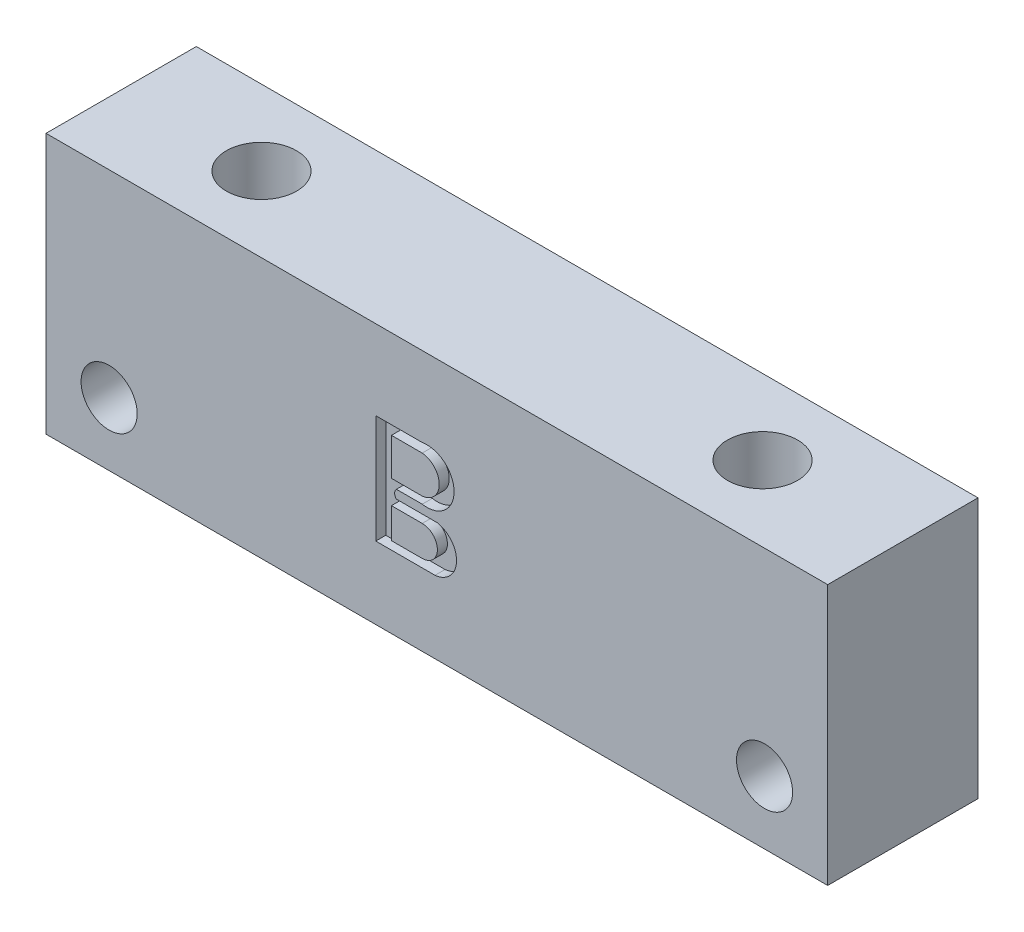
ISO-10303-21;
HEADER;
FILE_DESCRIPTION(('STEP AP214'),'2;1');
FILE_NAME('part.step','',(''),(''),'','','');
FILE_SCHEMA(('AUTOMOTIVE_DESIGN { 1 0 10303 214 1 1 1 1 }'));
ENDSEC;
DATA;
#1=APPLICATION_CONTEXT('core data for automotive mechanical design processes');
#2=APPLICATION_PROTOCOL_DEFINITION('international standard','automotive_design',2000,#1);
#3=PRODUCT_CONTEXT('',#1,'mechanical');
#4=PRODUCT('Part','Part','',(#3));
#5=PRODUCT_RELATED_PRODUCT_CATEGORY('part','',(#4));
#6=PRODUCT_DEFINITION_FORMATION('','',#4);
#7=PRODUCT_DEFINITION_CONTEXT('part definition',#1,'design');
#8=PRODUCT_DEFINITION('design','',#6,#7);
#9=PRODUCT_DEFINITION_SHAPE('','',#8);
#10=(LENGTH_UNIT() NAMED_UNIT(*) SI_UNIT(.MILLI.,.METRE.));
#11=(NAMED_UNIT(*) PLANE_ANGLE_UNIT() SI_UNIT($,.RADIAN.));
#12=(NAMED_UNIT(*) SI_UNIT($,.STERADIAN.) SOLID_ANGLE_UNIT());
#13=UNCERTAINTY_MEASURE_WITH_UNIT(LENGTH_MEASURE(1.E-05),#10,'distance_accuracy_value','');
#14=(GEOMETRIC_REPRESENTATION_CONTEXT(3) GLOBAL_UNCERTAINTY_ASSIGNED_CONTEXT((#13)) GLOBAL_UNIT_ASSIGNED_CONTEXT((#10,
#11,#12)) REPRESENTATION_CONTEXT('',''));
#15=CARTESIAN_POINT('',(0.,0.,0.));
#16=DIRECTION('',(0.,0.,1.));
#17=DIRECTION('',(1.,0.,0.));
#18=AXIS2_PLACEMENT_3D('',#15,#16,#17);
#19=CARTESIAN_POINT('',(-18.2419404705883,-13.3884381338742,-7.5));
#20=DIRECTION('',(0.,-1.,0.));
#21=DIRECTION('',(0.,0.,-1.));
#22=AXIS2_PLACEMENT_3D('',#19,#20,#21);
#23=PLANE('',#22);
#24=CARTESIAN_POINT('',(13.7580595294118,-13.3884381338742,-3.75));
#25=DIRECTION('',(0.,1.,0.));
#26=DIRECTION('',(-1.,0.,0.));
#27=AXIS2_PLACEMENT_3D('',#24,#25,#26);
#28=CIRCLE('',#27,1.75);
#29=CARTESIAN_POINT('',(12.0080595294118,-13.3884381338742,-3.75));
#30=VERTEX_POINT('',#29);
#31=EDGE_CURVE('E307',#30,#30,#28,.T.);
#32=ORIENTED_EDGE('',*,*,#31,.T.);
#33=EDGE_LOOP('',(#32));
#34=FACE_BOUND('',#33,.T.);
#35=CARTESIAN_POINT('',(-11.2419404705882,-13.3884381338742,-3.75));
#36=DIRECTION('',(0.,1.,0.));
#37=DIRECTION('',(-1.,0.,0.));
#38=AXIS2_PLACEMENT_3D('',#35,#36,#37);
#39=CIRCLE('',#38,1.75);
#40=CARTESIAN_POINT('',(-12.9919404705882,-13.3884381338742,-3.75));
#41=VERTEX_POINT('',#40);
#42=EDGE_CURVE('E313',#41,#41,#39,.T.);
#43=ORIENTED_EDGE('',*,*,#42,.T.);
#44=EDGE_LOOP('',(#43));
#45=FACE_BOUND('',#44,.T.);
#46=DIRECTION('',(1.,0.,0.));
#47=VECTOR('',#46,1.);
#48=CARTESIAN_POINT('',(-18.2419404705883,-13.3884381338742,0.));
#49=LINE('',#48,#47);
#50=CARTESIAN_POINT('',(-18.2419404705883,-13.3884381338742,0.));
#51=VERTEX_POINT('',#50);
#52=CARTESIAN_POINT('',(20.7580595294117,-13.3884381338742,0.));
#53=VERTEX_POINT('',#52);
#54=EDGE_CURVE('E328',#51,#53,#49,.T.);
#55=ORIENTED_EDGE('',*,*,#54,.F.);
#56=DIRECTION('',(0.,0.,1.));
#57=VECTOR('',#56,1.);
#58=CARTESIAN_POINT('',(-18.2419404705883,-13.3884381338742,-7.5));
#59=LINE('',#58,#57);
#60=CARTESIAN_POINT('',(-18.2419404705883,-13.3884381338742,-7.5));
#61=VERTEX_POINT('',#60);
#62=EDGE_CURVE('E11',#61,#51,#59,.T.);
#63=ORIENTED_EDGE('',*,*,#62,.F.);
#64=DIRECTION('',(1.,0.,0.));
#65=VECTOR('',#64,1.);
#66=CARTESIAN_POINT('',(-18.2419404705883,-13.3884381338742,-7.5));
#67=LINE('',#66,#65);
#68=CARTESIAN_POINT('',(20.7580595294117,-13.3884381338742,-7.5));
#69=VERTEX_POINT('',#68);
#70=EDGE_CURVE('E331',#61,#69,#67,.T.);
#71=ORIENTED_EDGE('',*,*,#70,.T.);
#72=DIRECTION('',(0.,0.,1.));
#73=VECTOR('',#72,1.);
#74=CARTESIAN_POINT('',(20.7580595294117,-13.3884381338742,-7.5));
#75=LINE('',#74,#73);
#76=EDGE_CURVE('E35',#69,#53,#75,.T.);
#77=ORIENTED_EDGE('',*,*,#76,.T.);
#78=EDGE_LOOP('',(#55,#63,#71,#77));
#79=FACE_BOUND('',#78,.T.);
#80=ADVANCED_FACE('F32',(#34,#45,#79),#23,.T.);
#81=CARTESIAN_POINT('',(-18.2419404705883,-0.388438133874243,-7.5));
#82=DIRECTION('',(-1.,0.,0.));
#83=DIRECTION('',(0.,-1.,0.));
#84=AXIS2_PLACEMENT_3D('',#81,#82,#83);
#85=PLANE('',#84);
#86=DIRECTION('',(0.,-1.,0.));
#87=VECTOR('',#86,1.);
#88=CARTESIAN_POINT('',(-18.2419404705883,-0.388438133874243,0.));
#89=LINE('',#88,#87);
#90=CARTESIAN_POINT('',(-18.2419404705883,-0.388438133874243,0.));
#91=VERTEX_POINT('',#90);
#92=EDGE_CURVE('E335',#91,#51,#89,.T.);
#93=ORIENTED_EDGE('',*,*,#92,.F.);
#94=DIRECTION('',(0.,0.,1.));
#95=VECTOR('',#94,1.);
#96=CARTESIAN_POINT('',(-18.2419404705883,-0.388438133874243,-7.5));
#97=LINE('',#96,#95);
#98=CARTESIAN_POINT('',(-18.2419404705883,-0.388438133874243,-7.5));
#99=VERTEX_POINT('',#98);
#100=EDGE_CURVE('E40',#99,#91,#97,.T.);
#101=ORIENTED_EDGE('',*,*,#100,.F.);
#102=DIRECTION('',(0.,-1.,0.));
#103=VECTOR('',#102,1.);
#104=CARTESIAN_POINT('',(-18.2419404705883,-0.388438133874243,-7.5));
#105=LINE('',#104,#103);
#106=EDGE_CURVE('E341',#99,#61,#105,.T.);
#107=ORIENTED_EDGE('',*,*,#106,.T.);
#108=ORIENTED_EDGE('',*,*,#62,.T.);
#109=EDGE_LOOP('',(#93,#101,#107,#108));
#110=FACE_BOUND('',#109,.T.);
#111=ADVANCED_FACE('F367',(#110),#85,.T.);
#112=CARTESIAN_POINT('',(20.7580595294117,-0.388438133874238,-7.5));
#113=DIRECTION('',(0.,1.,0.));
#114=DIRECTION('',(-1.,0.,0.));
#115=AXIS2_PLACEMENT_3D('',#112,#113,#114);
#116=PLANE('',#115);
#117=CARTESIAN_POINT('',(13.7580595294118,-0.388438133874239,-3.75));
#118=DIRECTION('',(0.,1.,0.));
#119=DIRECTION('',(-1.,0.,0.));
#120=AXIS2_PLACEMENT_3D('',#117,#118,#119);
#121=CIRCLE('',#120,1.75);
#122=CARTESIAN_POINT('',(12.0080595294118,-0.388438133874239,-3.75));
#123=VERTEX_POINT('',#122);
#124=EDGE_CURVE('E293',#123,#123,#121,.T.);
#125=ORIENTED_EDGE('',*,*,#124,.F.);
#126=EDGE_LOOP('',(#125));
#127=FACE_BOUND('',#126,.T.);
#128=CARTESIAN_POINT('',(-11.2419404705883,-0.388438133874242,-3.75));
#129=DIRECTION('',(0.,1.,0.));
#130=DIRECTION('',(-1.,0.,0.));
#131=AXIS2_PLACEMENT_3D('',#128,#129,#130);
#132=CIRCLE('',#131,1.75);
#133=CARTESIAN_POINT('',(-12.9919404705883,-0.388438133874242,-3.75));
#134=VERTEX_POINT('',#133);
#135=EDGE_CURVE('E310',#134,#134,#132,.T.);
#136=ORIENTED_EDGE('',*,*,#135,.F.);
#137=EDGE_LOOP('',(#136));
#138=FACE_BOUND('',#137,.T.);
#139=DIRECTION('',(-1.,0.,0.));
#140=VECTOR('',#139,1.);
#141=CARTESIAN_POINT('',(20.7580595294117,-0.388438133874238,0.));
#142=LINE('',#141,#140);
#143=CARTESIAN_POINT('',(20.7580595294117,-0.388438133874238,0.));
#144=VERTEX_POINT('',#143);
#145=EDGE_CURVE('E349',#144,#91,#142,.T.);
#146=ORIENTED_EDGE('',*,*,#145,.F.);
#147=DIRECTION('',(0.,0.,1.));
#148=VECTOR('',#147,1.);
#149=CARTESIAN_POINT('',(20.7580595294117,-0.388438133874238,-7.5));
#150=LINE('',#149,#148);
#151=CARTESIAN_POINT('',(20.7580595294117,-0.388438133874238,-7.5));
#152=VERTEX_POINT('',#151);
#153=EDGE_CURVE('E354',#152,#144,#150,.T.);
#154=ORIENTED_EDGE('',*,*,#153,.F.);
#155=DIRECTION('',(-1.,0.,0.));
#156=VECTOR('',#155,1.);
#157=CARTESIAN_POINT('',(20.7580595294117,-0.388438133874238,-7.5));
#158=LINE('',#157,#156);
#159=EDGE_CURVE('E338',#152,#99,#158,.T.);
#160=ORIENTED_EDGE('',*,*,#159,.T.);
#161=ORIENTED_EDGE('',*,*,#100,.T.);
#162=EDGE_LOOP('',(#146,#154,#160,#161));
#163=FACE_BOUND('',#162,.T.);
#164=ADVANCED_FACE('F373',(#127,#138,#163),#116,.T.);
#165=CARTESIAN_POINT('',(20.7580595294117,-13.3884381338742,-7.5));
#166=DIRECTION('',(1.,0.,0.));
#167=DIRECTION('',(0.,0.,-1.));
#168=AXIS2_PLACEMENT_3D('',#165,#166,#167);
#169=PLANE('',#168);
#170=DIRECTION('',(0.,1.,0.));
#171=VECTOR('',#170,1.);
#172=CARTESIAN_POINT('',(20.7580595294117,-13.3884381338742,0.));
#173=LINE('',#172,#171);
#174=EDGE_CURVE('E346',#53,#144,#173,.T.);
#175=ORIENTED_EDGE('',*,*,#174,.F.);
#176=ORIENTED_EDGE('',*,*,#76,.F.);
#177=DIRECTION('',(0.,1.,0.));
#178=VECTOR('',#177,1.);
#179=CARTESIAN_POINT('',(20.7580595294117,-13.3884381338742,-7.5));
#180=LINE('',#179,#178);
#181=EDGE_CURVE('E334',#69,#152,#180,.T.);
#182=ORIENTED_EDGE('',*,*,#181,.T.);
#183=ORIENTED_EDGE('',*,*,#153,.T.);
#184=EDGE_LOOP('',(#175,#176,#182,#183));
#185=FACE_BOUND('',#184,.T.);
#186=ADVANCED_FACE('F362',(#185),#169,.T.);
#187=CARTESIAN_POINT('',(0.,0.,-7.5));
#188=DIRECTION('',(0.,0.,1.));
#189=DIRECTION('',(1.,0.,0.));
#190=AXIS2_PLACEMENT_3D('',#187,#188,#189);
#191=PLANE('',#190);
#192=CARTESIAN_POINT('',(17.6080595294117,-10.2384381338742,-7.5));
#193=DIRECTION('',(0.,0.,1.));
#194=DIRECTION('',(1.,0.,0.));
#195=AXIS2_PLACEMENT_3D('',#192,#193,#194);
#196=CIRCLE('',#195,1.4);
#197=CARTESIAN_POINT('',(19.0080595294117,-10.2384381338742,-7.5));
#198=VERTEX_POINT('',#197);
#199=EDGE_CURVE('E319',#198,#198,#196,.T.);
#200=ORIENTED_EDGE('',*,*,#199,.T.);
#201=EDGE_LOOP('',(#200));
#202=FACE_BOUND('',#201,.T.);
#203=CARTESIAN_POINT('',(-15.0919404705883,-10.2384381338742,-7.5));
#204=DIRECTION('',(0.,0.,1.));
#205=DIRECTION('',(1.,0.,0.));
#206=AXIS2_PLACEMENT_3D('',#203,#204,#205);
#207=CIRCLE('',#206,1.4);
#208=CARTESIAN_POINT('',(-13.6919404705883,-10.2384381338742,-7.5));
#209=VERTEX_POINT('',#208);
#210=EDGE_CURVE('E325',#209,#209,#207,.T.);
#211=ORIENTED_EDGE('',*,*,#210,.T.);
#212=EDGE_LOOP('',(#211));
#213=FACE_BOUND('',#212,.T.);
#214=ORIENTED_EDGE('',*,*,#70,.F.);
#215=ORIENTED_EDGE('',*,*,#106,.F.);
#216=ORIENTED_EDGE('',*,*,#159,.F.);
#217=ORIENTED_EDGE('',*,*,#181,.F.);
#218=EDGE_LOOP('',(#214,#215,#216,#217));
#219=FACE_BOUND('',#218,.T.);
#220=ADVANCED_FACE('F370',(#202,#213,#219),#191,.F.);
#221=CARTESIAN_POINT('',(0.,0.,0.));
#222=DIRECTION('',(0.,0.,1.));
#223=DIRECTION('',(1.,0.,0.));
#224=AXIS2_PLACEMENT_3D('',#221,#222,#223);
#225=PLANE('',#224);
#226=DIRECTION('',(0.,-1.,0.));
#227=VECTOR('',#226,1.);
#228=CARTESIAN_POINT('',(-1.78948456051842,-4.36198499661344,0.));
#229=LINE('',#228,#227);
#230=CARTESIAN_POINT('',(-1.78948456051842,-4.36198499661344,0.));
#231=VERTEX_POINT('',#230);
#232=CARTESIAN_POINT('',(-1.78948456051842,-9.78079470513649,0.));
#233=VERTEX_POINT('',#232);
#234=EDGE_CURVE('E48',#231,#233,#229,.T.);
#235=ORIENTED_EDGE('',*,*,#234,.F.);
#236=DIRECTION('',(-1.,0.,0.));
#237=VECTOR('',#236,1.);
#238=CARTESIAN_POINT('',(-1.78948456051842,-4.36198499661344,0.));
#239=LINE('',#238,#237);
#240=CARTESIAN_POINT('',(0.528429433948041,-4.36198499661344,0.));
#241=VERTEX_POINT('',#240);
#242=EDGE_CURVE('E248',#241,#231,#239,.T.);
#243=ORIENTED_EDGE('',*,*,#242,.F.);
#244=CARTESIAN_POINT('',(0.764662766271646,-5.69476469604169,0.));
#245=DIRECTION('',(0.,0.,1.));
#246=DIRECTION('',(-1.,0.,0.));
#247=AXIS2_PLACEMENT_3D('',#244,#245,#246);
#248=CIRCLE('',#247,1.35355380924024);
#249=CARTESIAN_POINT('',(0.528429433948041,-7.02754439546993,0.));
#250=VERTEX_POINT('',#249);
#251=EDGE_CURVE('E286',#250,#241,#248,.T.);
#252=ORIENTED_EDGE('',*,*,#251,.F.);
#253=DIRECTION('',(1.,0.,0.));
#254=VECTOR('',#253,1.);
#255=CARTESIAN_POINT('',(0.528429433948041,-7.02754439546993,0.));
#256=LINE('',#255,#254);
#257=CARTESIAN_POINT('',(-0.758815546584968,-7.02754439546993,0.));
#258=VERTEX_POINT('',#257);
#259=EDGE_CURVE('E283',#258,#250,#256,.T.);
#260=ORIENTED_EDGE('',*,*,#259,.F.);
#261=CARTESIAN_POINT('',(-0.545804965205176,-7.24055497684972,0.));
#262=DIRECTION('',(0.,0.,-1.));
#263=DIRECTION('',(1.,0.,0.));
#264=AXIS2_PLACEMENT_3D('',#261,#262,#263);
#265=CIRCLE('',#264,0.301242453116279);
#266=CARTESIAN_POINT('',(-0.758815546584968,-7.45356555822951,0.));
#267=VERTEX_POINT('',#266);
#268=EDGE_CURVE('E280',#267,#258,#265,.T.);
#269=ORIENTED_EDGE('',*,*,#268,.F.);
#270=DIRECTION('',(-1.,0.,0.));
#271=VECTOR('',#270,1.);
#272=CARTESIAN_POINT('',(-0.758815546584968,-7.45356555822951,0.));
#273=LINE('',#272,#271);
#274=CARTESIAN_POINT('',(1.28563615484278,-7.45356555822951,0.));
#275=VERTEX_POINT('',#274);
#276=EDGE_CURVE('E277',#275,#267,#273,.T.);
#277=ORIENTED_EDGE('',*,*,#276,.F.);
#278=CARTESIAN_POINT('',(1.06369113217994,-8.60896906760546,0.));
#279=DIRECTION('',(0.,0.,1.));
#280=DIRECTION('',(-1.,0.,0.));
#281=AXIS2_PLACEMENT_3D('',#278,#279,#280);
#282=CIRCLE('',#281,1.17652745933236);
#283=CARTESIAN_POINT('',(1.16876985404146,-9.78079470513649,0.));
#284=VERTEX_POINT('',#283);
#285=EDGE_CURVE('E274',#284,#275,#282,.T.);
#286=ORIENTED_EDGE('',*,*,#285,.F.);
#287=DIRECTION('',(1.,0.,0.));
#288=VECTOR('',#287,1.);
#289=CARTESIAN_POINT('',(1.16876985404146,-9.78079470513649,0.));
#290=LINE('',#289,#288);
#291=EDGE_CURVE('E271',#233,#284,#290,.T.);
#292=ORIENTED_EDGE('',*,*,#291,.F.);
#293=EDGE_LOOP('',(#235,#243,#252,#260,#269,#277,#286,#292));
#294=FACE_BOUND('',#293,.T.);
#295=CARTESIAN_POINT('',(17.6080595294117,-10.2384381338742,0.));
#296=DIRECTION('',(0.,0.,1.));
#297=DIRECTION('',(1.,0.,0.));
#298=AXIS2_PLACEMENT_3D('',#295,#296,#297);
#299=CIRCLE('',#298,1.4);
#300=CARTESIAN_POINT('',(19.0080595294117,-10.2384381338742,0.));
#301=VERTEX_POINT('',#300);
#302=EDGE_CURVE('E316',#301,#301,#299,.T.);
#303=ORIENTED_EDGE('',*,*,#302,.F.);
#304=EDGE_LOOP('',(#303));
#305=FACE_BOUND('',#304,.T.);
#306=CARTESIAN_POINT('',(-15.0919404705883,-10.2384381338742,0.));
#307=DIRECTION('',(0.,0.,1.));
#308=DIRECTION('',(1.,0.,0.));
#309=AXIS2_PLACEMENT_3D('',#306,#307,#308);
#310=CIRCLE('',#309,1.4);
#311=CARTESIAN_POINT('',(-13.6919404705883,-10.2384381338742,0.));
#312=VERTEX_POINT('',#311);
#313=EDGE_CURVE('E322',#312,#312,#310,.T.);
#314=ORIENTED_EDGE('',*,*,#313,.F.);
#315=EDGE_LOOP('',(#314));
#316=FACE_BOUND('',#315,.T.);
#317=ORIENTED_EDGE('',*,*,#54,.T.);
#318=ORIENTED_EDGE('',*,*,#174,.T.);
#319=ORIENTED_EDGE('',*,*,#145,.T.);
#320=ORIENTED_EDGE('',*,*,#92,.T.);
#321=EDGE_LOOP('',(#317,#318,#319,#320));
#322=FACE_BOUND('',#321,.T.);
#323=ADVANCED_FACE('F364',(#294,#305,#316,#322),#225,.T.);
#324=CARTESIAN_POINT('',(-15.0919404705883,-10.2384381338742,-7.5));
#325=DIRECTION('',(0.,0.,1.));
#326=DIRECTION('',(1.,0.,0.));
#327=AXIS2_PLACEMENT_3D('',#324,#325,#326);
#328=CYLINDRICAL_SURFACE('',#327,1.4);
#329=ORIENTED_EDGE('',*,*,#210,.F.);
#330=EDGE_LOOP('',(#329));
#331=FACE_BOUND('',#330,.T.);
#332=ORIENTED_EDGE('',*,*,#313,.T.);
#333=EDGE_LOOP('',(#332));
#334=FACE_BOUND('',#333,.T.);
#335=ADVANCED_FACE('F406',(#331,#334),#328,.F.);
#336=CARTESIAN_POINT('',(17.6080595294117,-10.2384381338742,-7.5));
#337=DIRECTION('',(0.,0.,1.));
#338=DIRECTION('',(1.,0.,0.));
#339=AXIS2_PLACEMENT_3D('',#336,#337,#338);
#340=CYLINDRICAL_SURFACE('',#339,1.4);
#341=ORIENTED_EDGE('',*,*,#199,.F.);
#342=EDGE_LOOP('',(#341));
#343=FACE_BOUND('',#342,.T.);
#344=ORIENTED_EDGE('',*,*,#302,.T.);
#345=EDGE_LOOP('',(#344));
#346=FACE_BOUND('',#345,.T.);
#347=ADVANCED_FACE('F396',(#343,#346),#340,.F.);
#348=CARTESIAN_POINT('',(-11.2419404705882,-13.3884381338742,-3.75));
#349=DIRECTION('',(0.,1.,0.));
#350=DIRECTION('',(-1.,0.,0.));
#351=AXIS2_PLACEMENT_3D('',#348,#349,#350);
#352=CYLINDRICAL_SURFACE('',#351,1.75);
#353=ORIENTED_EDGE('',*,*,#42,.F.);
#354=EDGE_LOOP('',(#353));
#355=FACE_BOUND('',#354,.T.);
#356=ORIENTED_EDGE('',*,*,#135,.T.);
#357=EDGE_LOOP('',(#356));
#358=FACE_BOUND('',#357,.T.);
#359=ADVANCED_FACE('F392',(#355,#358),#352,.F.);
#360=CARTESIAN_POINT('',(13.7580595294118,-13.3884381338742,-3.75));
#361=DIRECTION('',(0.,1.,0.));
#362=DIRECTION('',(-1.,0.,0.));
#363=AXIS2_PLACEMENT_3D('',#360,#361,#362);
#364=CYLINDRICAL_SURFACE('',#363,1.75);
#365=ORIENTED_EDGE('',*,*,#31,.F.);
#366=EDGE_LOOP('',(#365));
#367=FACE_BOUND('',#366,.T.);
#368=ORIENTED_EDGE('',*,*,#124,.T.);
#369=EDGE_LOOP('',(#368));
#370=FACE_BOUND('',#369,.T.);
#371=ADVANCED_FACE('F395',(#367,#370),#364,.F.);
#372=CARTESIAN_POINT('',(-1.78948456051842,-4.36198499661344,-0.5));
#373=DIRECTION('',(-1.,0.,0.));
#374=DIRECTION('',(0.,-1.,0.));
#375=AXIS2_PLACEMENT_3D('',#372,#373,#374);
#376=PLANE('',#375);
#377=ORIENTED_EDGE('',*,*,#234,.T.);
#378=DIRECTION('',(0.,0.,1.));
#379=VECTOR('',#378,1.);
#380=CARTESIAN_POINT('',(-1.78948456051842,-9.78079470513649,-0.5));
#381=LINE('',#380,#379);
#382=CARTESIAN_POINT('',(-1.78948456051842,-9.78079470513649,-0.5));
#383=VERTEX_POINT('',#382);
#384=EDGE_CURVE('E269',#383,#233,#381,.T.);
#385=ORIENTED_EDGE('',*,*,#384,.F.);
#386=DIRECTION('',(0.,-1.,0.));
#387=VECTOR('',#386,1.);
#388=CARTESIAN_POINT('',(-1.78948456051842,-4.36198499661344,-0.5));
#389=LINE('',#388,#387);
#390=CARTESIAN_POINT('',(-1.78948456051842,-4.36198499661344,-0.5));
#391=VERTEX_POINT('',#390);
#392=EDGE_CURVE('E244',#391,#383,#389,.T.);
#393=ORIENTED_EDGE('',*,*,#392,.F.);
#394=DIRECTION('',(0.,0.,1.));
#395=VECTOR('',#394,1.);
#396=CARTESIAN_POINT('',(-1.78948456051842,-4.36198499661344,-0.5));
#397=LINE('',#396,#395);
#398=EDGE_CURVE('E291',#391,#231,#397,.T.);
#399=ORIENTED_EDGE('',*,*,#398,.T.);
#400=EDGE_LOOP('',(#377,#385,#393,#399));
#401=FACE_BOUND('',#400,.T.);
#402=ADVANCED_FACE('F403',(#401),#376,.F.);
#403=CARTESIAN_POINT('',(-1.78948456051842,-4.36198499661344,-0.5));
#404=DIRECTION('',(0.,1.,0.));
#405=DIRECTION('',(0.,0.,1.));
#406=AXIS2_PLACEMENT_3D('',#403,#404,#405);
#407=PLANE('',#406);
#408=ORIENTED_EDGE('',*,*,#242,.T.);
#409=ORIENTED_EDGE('',*,*,#398,.F.);
#410=DIRECTION('',(-1.,0.,0.));
#411=VECTOR('',#410,1.);
#412=CARTESIAN_POINT('',(-1.78948456051842,-4.36198499661344,-0.5));
#413=LINE('',#412,#411);
#414=CARTESIAN_POINT('',(0.528429433948041,-4.36198499661344,-0.5));
#415=VERTEX_POINT('',#414);
#416=EDGE_CURVE('E266',#415,#391,#413,.T.);
#417=ORIENTED_EDGE('',*,*,#416,.F.);
#418=DIRECTION('',(0.,0.,1.));
#419=VECTOR('',#418,1.);
#420=CARTESIAN_POINT('',(0.528429433948041,-4.36198499661344,-0.5));
#421=LINE('',#420,#419);
#422=EDGE_CURVE('E294',#415,#241,#421,.T.);
#423=ORIENTED_EDGE('',*,*,#422,.T.);
#424=EDGE_LOOP('',(#408,#409,#417,#423));
#425=FACE_BOUND('',#424,.T.);
#426=ADVANCED_FACE('F464',(#425),#407,.F.);
#427=CARTESIAN_POINT('',(0.764662766271646,-5.69476469604169,-0.5));
#428=DIRECTION('',(0.,0.,1.));
#429=DIRECTION('',(1.,0.,0.));
#430=AXIS2_PLACEMENT_3D('',#427,#428,#429);
#431=CYLINDRICAL_SURFACE('',#430,1.35355380924024);
#432=ORIENTED_EDGE('',*,*,#251,.T.);
#433=ORIENTED_EDGE('',*,*,#422,.F.);
#434=CARTESIAN_POINT('',(0.764662766271646,-5.69476469604169,-0.5));
#435=DIRECTION('',(0.,0.,1.));
#436=DIRECTION('',(-1.,0.,0.));
#437=AXIS2_PLACEMENT_3D('',#434,#435,#436);
#438=CIRCLE('',#437,1.35355380924024);
#439=CARTESIAN_POINT('',(0.528429433948041,-7.02754439546993,-0.5));
#440=VERTEX_POINT('',#439);
#441=EDGE_CURVE('E263',#440,#415,#438,.T.);
#442=ORIENTED_EDGE('',*,*,#441,.F.);
#443=DIRECTION('',(0.,0.,1.));
#444=VECTOR('',#443,1.);
#445=CARTESIAN_POINT('',(0.528429433948041,-7.02754439546993,-0.5));
#446=LINE('',#445,#444);
#447=EDGE_CURVE('E296',#440,#250,#446,.T.);
#448=ORIENTED_EDGE('',*,*,#447,.T.);
#449=EDGE_LOOP('',(#432,#433,#442,#448));
#450=FACE_BOUND('',#449,.T.);
#451=ADVANCED_FACE('F467',(#450),#431,.F.);
#452=CARTESIAN_POINT('',(0.528429433948041,-7.02754439546993,-0.5));
#453=DIRECTION('',(0.,-1.,0.));
#454=DIRECTION('',(0.,0.,-1.));
#455=AXIS2_PLACEMENT_3D('',#452,#453,#454);
#456=PLANE('',#455);
#457=ORIENTED_EDGE('',*,*,#259,.T.);
#458=ORIENTED_EDGE('',*,*,#447,.F.);
#459=DIRECTION('',(1.,0.,0.));
#460=VECTOR('',#459,1.);
#461=CARTESIAN_POINT('',(0.528429433948041,-7.02754439546993,-0.5));
#462=LINE('',#461,#460);
#463=CARTESIAN_POINT('',(-0.758815546584968,-7.02754439546993,-0.5));
#464=VERTEX_POINT('',#463);
#465=EDGE_CURVE('E260',#464,#440,#462,.T.);
#466=ORIENTED_EDGE('',*,*,#465,.F.);
#467=DIRECTION('',(0.,0.,1.));
#468=VECTOR('',#467,1.);
#469=CARTESIAN_POINT('',(-0.758815546584968,-7.02754439546993,-0.5));
#470=LINE('',#469,#468);
#471=EDGE_CURVE('E298',#464,#258,#470,.T.);
#472=ORIENTED_EDGE('',*,*,#471,.T.);
#473=EDGE_LOOP('',(#457,#458,#466,#472));
#474=FACE_BOUND('',#473,.T.);
#475=ADVANCED_FACE('F471',(#474),#456,.F.);
#476=CARTESIAN_POINT('',(-0.545804965205176,-7.24055497684972,-0.5));
#477=DIRECTION('',(0.,0.,1.));
#478=DIRECTION('',(1.,0.,0.));
#479=AXIS2_PLACEMENT_3D('',#476,#477,#478);
#480=CYLINDRICAL_SURFACE('',#479,0.301242453116279);
#481=ORIENTED_EDGE('',*,*,#268,.T.);
#482=ORIENTED_EDGE('',*,*,#471,.F.);
#483=CARTESIAN_POINT('',(-0.545804965205176,-7.24055497684972,-0.5));
#484=DIRECTION('',(0.,0.,-1.));
#485=DIRECTION('',(1.,0.,0.));
#486=AXIS2_PLACEMENT_3D('',#483,#484,#485);
#487=CIRCLE('',#486,0.301242453116279);
#488=CARTESIAN_POINT('',(-0.758815546584968,-7.45356555822951,-0.5));
#489=VERTEX_POINT('',#488);
#490=EDGE_CURVE('E257',#489,#464,#487,.T.);
#491=ORIENTED_EDGE('',*,*,#490,.F.);
#492=DIRECTION('',(0.,0.,1.));
#493=VECTOR('',#492,1.);
#494=CARTESIAN_POINT('',(-0.758815546584968,-7.45356555822951,-0.5));
#495=LINE('',#494,#493);
#496=EDGE_CURVE('E300',#489,#267,#495,.T.);
#497=ORIENTED_EDGE('',*,*,#496,.T.);
#498=EDGE_LOOP('',(#481,#482,#491,#497));
#499=FACE_BOUND('',#498,.T.);
#500=ADVANCED_FACE('F475',(#499),#480,.T.);
#501=CARTESIAN_POINT('',(-0.758815546584968,-7.45356555822951,-0.5));
#502=DIRECTION('',(0.,1.,0.));
#503=DIRECTION('',(0.,0.,1.));
#504=AXIS2_PLACEMENT_3D('',#501,#502,#503);
#505=PLANE('',#504);
#506=ORIENTED_EDGE('',*,*,#276,.T.);
#507=ORIENTED_EDGE('',*,*,#496,.F.);
#508=DIRECTION('',(-1.,0.,0.));
#509=VECTOR('',#508,1.);
#510=CARTESIAN_POINT('',(-0.758815546584968,-7.45356555822951,-0.5));
#511=LINE('',#510,#509);
#512=CARTESIAN_POINT('',(1.28563615484278,-7.45356555822951,-0.5));
#513=VERTEX_POINT('',#512);
#514=EDGE_CURVE('E254',#513,#489,#511,.T.);
#515=ORIENTED_EDGE('',*,*,#514,.F.);
#516=DIRECTION('',(0.,0.,1.));
#517=VECTOR('',#516,1.);
#518=CARTESIAN_POINT('',(1.28563615484278,-7.45356555822951,-0.5));
#519=LINE('',#518,#517);
#520=EDGE_CURVE('E302',#513,#275,#519,.T.);
#521=ORIENTED_EDGE('',*,*,#520,.T.);
#522=EDGE_LOOP('',(#506,#507,#515,#521));
#523=FACE_BOUND('',#522,.T.);
#524=ADVANCED_FACE('F479',(#523),#505,.F.);
#525=CARTESIAN_POINT('',(1.06369113217994,-8.60896906760546,-0.5));
#526=DIRECTION('',(0.,0.,1.));
#527=DIRECTION('',(1.,0.,0.));
#528=AXIS2_PLACEMENT_3D('',#525,#526,#527);
#529=CYLINDRICAL_SURFACE('',#528,1.17652745933236);
#530=ORIENTED_EDGE('',*,*,#285,.T.);
#531=ORIENTED_EDGE('',*,*,#520,.F.);
#532=CARTESIAN_POINT('',(1.06369113217994,-8.60896906760546,-0.5));
#533=DIRECTION('',(0.,0.,1.));
#534=DIRECTION('',(-1.,0.,0.));
#535=AXIS2_PLACEMENT_3D('',#532,#533,#534);
#536=CIRCLE('',#535,1.17652745933236);
#537=CARTESIAN_POINT('',(1.16876985404146,-9.78079470513649,-0.5));
#538=VERTEX_POINT('',#537);
#539=EDGE_CURVE('E251',#538,#513,#536,.T.);
#540=ORIENTED_EDGE('',*,*,#539,.F.);
#541=DIRECTION('',(0.,0.,1.));
#542=VECTOR('',#541,1.);
#543=CARTESIAN_POINT('',(1.16876985404146,-9.78079470513649,-0.5));
#544=LINE('',#543,#542);
#545=EDGE_CURVE('E304',#538,#284,#544,.T.);
#546=ORIENTED_EDGE('',*,*,#545,.T.);
#547=EDGE_LOOP('',(#530,#531,#540,#546));
#548=FACE_BOUND('',#547,.T.);
#549=ADVANCED_FACE('F483',(#548),#529,.F.);
#550=CARTESIAN_POINT('',(1.16876985404146,-9.78079470513649,-0.5));
#551=DIRECTION('',(0.,-1.,0.));
#552=DIRECTION('',(0.,0.,-1.));
#553=AXIS2_PLACEMENT_3D('',#550,#551,#552);
#554=PLANE('',#553);
#555=ORIENTED_EDGE('',*,*,#291,.T.);
#556=ORIENTED_EDGE('',*,*,#545,.F.);
#557=DIRECTION('',(1.,0.,0.));
#558=VECTOR('',#557,1.);
#559=CARTESIAN_POINT('',(1.16876985404146,-9.78079470513649,-0.5));
#560=LINE('',#559,#558);
#561=EDGE_CURVE('E247',#383,#538,#560,.T.);
#562=ORIENTED_EDGE('',*,*,#561,.F.);
#563=ORIENTED_EDGE('',*,*,#384,.T.);
#564=EDGE_LOOP('',(#555,#556,#562,#563));
#565=FACE_BOUND('',#564,.T.);
#566=ADVANCED_FACE('F463',(#565),#554,.F.);
#567=CARTESIAN_POINT('',(1.06369113217994,-8.60896906760546,-0.5));
#568=DIRECTION('',(0.,0.,-1.));
#569=DIRECTION('',(-1.,0.,0.));
#570=AXIS2_PLACEMENT_3D('',#567,#568,#569);
#571=PLANE('',#570);
#572=DIRECTION('',(-1.,0.,0.));
#573=VECTOR('',#572,1.);
#574=CARTESIAN_POINT('',(0.528429433948041,-4.81930558451182,-0.5));
#575=LINE('',#574,#573);
#576=CARTESIAN_POINT('',(0.528429433948041,-4.81930558451182,-0.5));
#577=VERTEX_POINT('',#576);
#578=CARTESIAN_POINT('',(-1.00649638053674,-4.81930558451182,-0.5));
#579=VERTEX_POINT('',#578);
#580=EDGE_CURVE('E189',#577,#579,#575,.T.);
#581=ORIENTED_EDGE('',*,*,#580,.F.);
#582=CARTESIAN_POINT('',(0.443970010058192,-5.74877001626106,-0.5));
#583=DIRECTION('',(0.,0.,1.));
#584=DIRECTION('',(-1.,0.,0.));
#585=AXIS2_PLACEMENT_3D('',#582,#583,#584);
#586=CIRCLE('',#585,0.933293910925567);
#587=CARTESIAN_POINT('',(0.528429433948041,-6.6782344480103,-0.5));
#588=VERTEX_POINT('',#587);
#589=EDGE_CURVE('E182',#588,#577,#586,.T.);
#590=ORIENTED_EDGE('',*,*,#589,.F.);
#591=DIRECTION('',(1.,0.,0.));
#592=VECTOR('',#591,1.);
#593=CARTESIAN_POINT('',(-1.00649638053674,-6.6782344480103,-0.5));
#594=LINE('',#593,#592);
#595=CARTESIAN_POINT('',(-1.00649638053674,-6.6782344480103,-0.5));
#596=VERTEX_POINT('',#595);
#597=EDGE_CURVE('E192',#596,#588,#594,.T.);
#598=ORIENTED_EDGE('',*,*,#597,.F.);
#599=DIRECTION('',(0.,-1.,0.));
#600=VECTOR('',#599,1.);
#601=CARTESIAN_POINT('',(-1.00649638053674,-4.81930558451182,-0.5));
#602=LINE('',#601,#600);
#603=EDGE_CURVE('E174',#579,#596,#602,.T.);
#604=ORIENTED_EDGE('',*,*,#603,.F.);
#605=EDGE_LOOP('',(#581,#590,#598,#604));
#606=FACE_BOUND('',#605,.T.);
#607=CARTESIAN_POINT('',(0.528429433948041,-8.61580259993033,-0.5));
#608=DIRECTION('',(0.,0.,1.));
#609=DIRECTION('',(-1.,0.,0.));
#610=AXIS2_PLACEMENT_3D('',#607,#608,#609);
#611=CIRCLE('',#610,0.757206720894743);
#612=CARTESIAN_POINT('',(0.528429433948041,-9.37300932082508,-0.5));
#613=VERTEX_POINT('',#612);
#614=CARTESIAN_POINT('',(0.528429433948041,-7.85859587903559,-0.5));
#615=VERTEX_POINT('',#614);
#616=EDGE_CURVE('E215',#613,#615,#611,.T.);
#617=ORIENTED_EDGE('',*,*,#616,.F.);
#618=DIRECTION('',(1.,0.,0.));
#619=VECTOR('',#618,1.);
#620=CARTESIAN_POINT('',(-1.00649638053674,-9.37300932082508,-0.5));
#621=LINE('',#620,#619);
#622=CARTESIAN_POINT('',(-1.00649638053674,-9.37300932082508,-0.5));
#623=VERTEX_POINT('',#622);
#624=EDGE_CURVE('E225',#623,#613,#621,.T.);
#625=ORIENTED_EDGE('',*,*,#624,.F.);
#626=DIRECTION('',(0.,-1.,0.));
#627=VECTOR('',#626,1.);
#628=CARTESIAN_POINT('',(-1.00649638053674,-7.85859587903559,-0.5));
#629=LINE('',#628,#627);
#630=CARTESIAN_POINT('',(-1.00649638053674,-7.85859587903559,-0.5));
#631=VERTEX_POINT('',#630);
#632=EDGE_CURVE('E222',#631,#623,#629,.T.);
#633=ORIENTED_EDGE('',*,*,#632,.F.);
#634=DIRECTION('',(-1.,0.,0.));
#635=VECTOR('',#634,1.);
#636=CARTESIAN_POINT('',(0.528429433948041,-7.85859587903559,-0.5));
#637=LINE('',#636,#635);
#638=EDGE_CURVE('E218',#615,#631,#637,.T.);
#639=ORIENTED_EDGE('',*,*,#638,.F.);
#640=EDGE_LOOP('',(#617,#625,#633,#639));
#641=FACE_BOUND('',#640,.T.);
#642=ORIENTED_EDGE('',*,*,#392,.T.);
#643=ORIENTED_EDGE('',*,*,#561,.T.);
#644=ORIENTED_EDGE('',*,*,#539,.T.);
#645=ORIENTED_EDGE('',*,*,#514,.T.);
#646=ORIENTED_EDGE('',*,*,#490,.T.);
#647=ORIENTED_EDGE('',*,*,#465,.T.);
#648=ORIENTED_EDGE('',*,*,#441,.T.);
#649=ORIENTED_EDGE('',*,*,#416,.T.);
#650=EDGE_LOOP('',(#642,#643,#644,#645,#646,#647,#648,#649));
#651=FACE_BOUND('',#650,.T.);
#652=ADVANCED_FACE('F186',(#606,#641,#651),#571,.F.);
#653=CARTESIAN_POINT('',(0.528429433948041,-8.61580259993033,-0.5));
#654=DIRECTION('',(0.,0.,1.));
#655=DIRECTION('',(1.,0.,0.));
#656=AXIS2_PLACEMENT_3D('',#653,#654,#655);
#657=CYLINDRICAL_SURFACE('',#656,0.757206720894743);
#658=CARTESIAN_POINT('',(0.528429433948041,-8.61580259993033,0.));
#659=DIRECTION('',(0.,0.,1.));
#660=DIRECTION('',(-1.,0.,0.));
#661=AXIS2_PLACEMENT_3D('',#658,#659,#660);
#662=CIRCLE('',#661,0.757206720894743);
#663=CARTESIAN_POINT('',(0.528429433948041,-9.37300932082508,0.));
#664=VERTEX_POINT('',#663);
#665=CARTESIAN_POINT('',(0.528429433948041,-7.85859587903559,0.));
#666=VERTEX_POINT('',#665);
#667=EDGE_CURVE('E211',#664,#666,#662,.T.);
#668=ORIENTED_EDGE('',*,*,#667,.F.);
#669=DIRECTION('',(0.,0.,1.));
#670=VECTOR('',#669,1.);
#671=CARTESIAN_POINT('',(0.528429433948041,-9.37300932082508,-0.5));
#672=LINE('',#671,#670);
#673=EDGE_CURVE('E237',#613,#664,#672,.T.);
#674=ORIENTED_EDGE('',*,*,#673,.F.);
#675=ORIENTED_EDGE('',*,*,#616,.T.);
#676=DIRECTION('',(0.,0.,1.));
#677=VECTOR('',#676,1.);
#678=CARTESIAN_POINT('',(0.528429433948041,-7.85859587903559,-0.5));
#679=LINE('',#678,#677);
#680=EDGE_CURVE('E228',#615,#666,#679,.T.);
#681=ORIENTED_EDGE('',*,*,#680,.T.);
#682=EDGE_LOOP('',(#668,#674,#675,#681));
#683=FACE_BOUND('',#682,.T.);
#684=ADVANCED_FACE('F451',(#683),#657,.T.);
#685=CARTESIAN_POINT('',(-1.00649638053674,-9.37300932082508,-0.5));
#686=DIRECTION('',(0.,-1.,0.));
#687=DIRECTION('',(0.,0.,-1.));
#688=AXIS2_PLACEMENT_3D('',#685,#686,#687);
#689=PLANE('',#688);
#690=DIRECTION('',(1.,0.,0.));
#691=VECTOR('',#690,1.);
#692=CARTESIAN_POINT('',(-1.00649638053674,-9.37300932082508,0.));
#693=LINE('',#692,#691);
#694=CARTESIAN_POINT('',(-1.00649638053674,-9.37300932082508,0.));
#695=VERTEX_POINT('',#694);
#696=EDGE_CURVE('E219',#695,#664,#693,.T.);
#697=ORIENTED_EDGE('',*,*,#696,.F.);
#698=DIRECTION('',(0.,0.,1.));
#699=VECTOR('',#698,1.);
#700=CARTESIAN_POINT('',(-1.00649638053674,-9.37300932082508,-0.5));
#701=LINE('',#700,#699);
#702=EDGE_CURVE('E239',#623,#695,#701,.T.);
#703=ORIENTED_EDGE('',*,*,#702,.F.);
#704=ORIENTED_EDGE('',*,*,#624,.T.);
#705=ORIENTED_EDGE('',*,*,#673,.T.);
#706=EDGE_LOOP('',(#697,#703,#704,#705));
#707=FACE_BOUND('',#706,.T.);
#708=ADVANCED_FACE('F447',(#707),#689,.T.);
#709=CARTESIAN_POINT('',(-1.00649638053674,-7.85859587903559,-0.5));
#710=DIRECTION('',(-1.,0.,0.));
#711=DIRECTION('',(0.,0.,1.));
#712=AXIS2_PLACEMENT_3D('',#709,#710,#711);
#713=PLANE('',#712);
#714=DIRECTION('',(0.,-1.,0.));
#715=VECTOR('',#714,1.);
#716=CARTESIAN_POINT('',(-1.00649638053674,-7.85859587903559,0.));
#717=LINE('',#716,#715);
#718=CARTESIAN_POINT('',(-1.00649638053674,-7.85859587903559,0.));
#719=VERTEX_POINT('',#718);
#720=EDGE_CURVE('E56',#719,#695,#717,.T.);
#721=ORIENTED_EDGE('',*,*,#720,.F.);
#722=DIRECTION('',(0.,0.,1.));
#723=VECTOR('',#722,1.);
#724=CARTESIAN_POINT('',(-1.00649638053674,-7.85859587903559,-0.5));
#725=LINE('',#724,#723);
#726=EDGE_CURVE('E241',#631,#719,#725,.T.);
#727=ORIENTED_EDGE('',*,*,#726,.F.);
#728=ORIENTED_EDGE('',*,*,#632,.T.);
#729=ORIENTED_EDGE('',*,*,#702,.T.);
#730=EDGE_LOOP('',(#721,#727,#728,#729));
#731=FACE_BOUND('',#730,.T.);
#732=ADVANCED_FACE('F450',(#731),#713,.T.);
#733=CARTESIAN_POINT('',(0.528429433948041,-7.85859587903559,-0.5));
#734=DIRECTION('',(0.,1.,0.));
#735=DIRECTION('',(0.,0.,1.));
#736=AXIS2_PLACEMENT_3D('',#733,#734,#735);
#737=PLANE('',#736);
#738=DIRECTION('',(-1.,0.,0.));
#739=VECTOR('',#738,1.);
#740=CARTESIAN_POINT('',(0.528429433948041,-7.85859587903559,0.));
#741=LINE('',#740,#739);
#742=EDGE_CURVE('E231',#666,#719,#741,.T.);
#743=ORIENTED_EDGE('',*,*,#742,.F.);
#744=ORIENTED_EDGE('',*,*,#680,.F.);
#745=ORIENTED_EDGE('',*,*,#638,.T.);
#746=ORIENTED_EDGE('',*,*,#726,.T.);
#747=EDGE_LOOP('',(#743,#744,#745,#746));
#748=FACE_BOUND('',#747,.T.);
#749=ADVANCED_FACE('F446',(#748),#737,.T.);
#750=CARTESIAN_POINT('',(0.528429433948041,-4.81930558451182,-0.5));
#751=DIRECTION('',(0.,1.,0.));
#752=DIRECTION('',(0.,0.,1.));
#753=AXIS2_PLACEMENT_3D('',#750,#751,#752);
#754=PLANE('',#753);
#755=DIRECTION('',(-1.,0.,0.));
#756=VECTOR('',#755,1.);
#757=CARTESIAN_POINT('',(0.528429433948041,-4.81930558451182,0.));
#758=LINE('',#757,#756);
#759=CARTESIAN_POINT('',(0.528429433948041,-4.81930558451182,0.));
#760=VERTEX_POINT('',#759);
#761=CARTESIAN_POINT('',(-1.00649638053674,-4.81930558451182,0.));
#762=VERTEX_POINT('',#761);
#763=EDGE_CURVE('E205',#760,#762,#758,.T.);
#764=ORIENTED_EDGE('',*,*,#763,.F.);
#765=DIRECTION('',(0.,0.,1.));
#766=VECTOR('',#765,1.);
#767=CARTESIAN_POINT('',(0.528429433948041,-4.81930558451182,-0.5));
#768=LINE('',#767,#766);
#769=EDGE_CURVE('E196',#577,#760,#768,.T.);
#770=ORIENTED_EDGE('',*,*,#769,.F.);
#771=ORIENTED_EDGE('',*,*,#580,.T.);
#772=DIRECTION('',(0.,0.,1.));
#773=VECTOR('',#772,1.);
#774=CARTESIAN_POINT('',(-1.00649638053674,-4.81930558451182,-0.5));
#775=LINE('',#774,#773);
#776=EDGE_CURVE('E170',#579,#762,#775,.T.);
#777=ORIENTED_EDGE('',*,*,#776,.T.);
#778=EDGE_LOOP('',(#764,#770,#771,#777));
#779=FACE_BOUND('',#778,.T.);
#780=ADVANCED_FACE('F195',(#779),#754,.T.);
#781=CARTESIAN_POINT('',(0.443970010058192,-5.74877001626106,-0.5));
#782=DIRECTION('',(0.,0.,1.));
#783=DIRECTION('',(1.,0.,0.));
#784=AXIS2_PLACEMENT_3D('',#781,#782,#783);
#785=CYLINDRICAL_SURFACE('',#784,0.933293910925567);
#786=CARTESIAN_POINT('',(0.443970010058192,-5.74877001626106,0.));
#787=DIRECTION('',(0.,0.,1.));
#788=DIRECTION('',(-1.,0.,0.));
#789=AXIS2_PLACEMENT_3D('',#786,#787,#788);
#790=CIRCLE('',#789,0.933293910925567);
#791=CARTESIAN_POINT('',(0.528429433948041,-6.6782344480103,0.));
#792=VERTEX_POINT('',#791);
#793=EDGE_CURVE('E197',#792,#760,#790,.T.);
#794=ORIENTED_EDGE('',*,*,#793,.F.);
#795=DIRECTION('',(0.,0.,1.));
#796=VECTOR('',#795,1.);
#797=CARTESIAN_POINT('',(0.528429433948041,-6.6782344480103,-0.5));
#798=LINE('',#797,#796);
#799=EDGE_CURVE('E212',#588,#792,#798,.T.);
#800=ORIENTED_EDGE('',*,*,#799,.F.);
#801=ORIENTED_EDGE('',*,*,#589,.T.);
#802=ORIENTED_EDGE('',*,*,#769,.T.);
#803=EDGE_LOOP('',(#794,#800,#801,#802));
#804=FACE_BOUND('',#803,.T.);
#805=ADVANCED_FACE('F432',(#804),#785,.T.);
#806=CARTESIAN_POINT('',(-1.00649638053674,-6.6782344480103,-0.5));
#807=DIRECTION('',(0.,-1.,0.));
#808=DIRECTION('',(0.,0.,-1.));
#809=AXIS2_PLACEMENT_3D('',#806,#807,#808);
#810=PLANE('',#809);
#811=DIRECTION('',(1.,0.,0.));
#812=VECTOR('',#811,1.);
#813=CARTESIAN_POINT('',(-1.00649638053674,-6.6782344480103,0.));
#814=LINE('',#813,#812);
#815=CARTESIAN_POINT('',(-1.00649638053674,-6.6782344480103,0.));
#816=VERTEX_POINT('',#815);
#817=EDGE_CURVE('E200',#816,#792,#814,.T.);
#818=ORIENTED_EDGE('',*,*,#817,.F.);
#819=DIRECTION('',(0.,0.,1.));
#820=VECTOR('',#819,1.);
#821=CARTESIAN_POINT('',(-1.00649638053674,-6.6782344480103,-0.5));
#822=LINE('',#821,#820);
#823=EDGE_CURVE('E181',#596,#816,#822,.T.);
#824=ORIENTED_EDGE('',*,*,#823,.F.);
#825=ORIENTED_EDGE('',*,*,#597,.T.);
#826=ORIENTED_EDGE('',*,*,#799,.T.);
#827=EDGE_LOOP('',(#818,#824,#825,#826));
#828=FACE_BOUND('',#827,.T.);
#829=ADVANCED_FACE('F434',(#828),#810,.T.);
#830=CARTESIAN_POINT('',(-1.00649638053674,-4.81930558451182,-0.5));
#831=DIRECTION('',(-1.,0.,0.));
#832=DIRECTION('',(0.,-1.,0.));
#833=AXIS2_PLACEMENT_3D('',#830,#831,#832);
#834=PLANE('',#833);
#835=DIRECTION('',(0.,-1.,0.));
#836=VECTOR('',#835,1.);
#837=CARTESIAN_POINT('',(-1.00649638053674,-4.81930558451182,0.));
#838=LINE('',#837,#836);
#839=EDGE_CURVE('E176',#762,#816,#838,.T.);
#840=ORIENTED_EDGE('',*,*,#839,.F.);
#841=ORIENTED_EDGE('',*,*,#776,.F.);
#842=ORIENTED_EDGE('',*,*,#603,.T.);
#843=ORIENTED_EDGE('',*,*,#823,.T.);
#844=EDGE_LOOP('',(#840,#841,#842,#843));
#845=FACE_BOUND('',#844,.T.);
#846=ADVANCED_FACE('F172',(#845),#834,.T.);
#847=ORIENTED_EDGE('',*,*,#696,.T.);
#848=ORIENTED_EDGE('',*,*,#667,.T.);
#849=ORIENTED_EDGE('',*,*,#742,.T.);
#850=ORIENTED_EDGE('',*,*,#720,.T.);
#851=EDGE_LOOP('',(#847,#848,#849,#850));
#852=FACE_BOUND('',#851,.T.);
#853=ADVANCED_FACE('F419',(#852),#225,.T.);
#854=ORIENTED_EDGE('',*,*,#793,.T.);
#855=ORIENTED_EDGE('',*,*,#763,.T.);
#856=ORIENTED_EDGE('',*,*,#839,.T.);
#857=ORIENTED_EDGE('',*,*,#817,.T.);
#858=EDGE_LOOP('',(#854,#855,#856,#857));
#859=FACE_BOUND('',#858,.T.);
#860=ADVANCED_FACE('F420',(#859),#225,.T.);
#861=CLOSED_SHELL('',(#80,#111,#164,#186,#220,#323,#335,#347,#359,#371,#402,#426,#451,#475,#500,
#524,#549,#566,#652,#684,#708,#732,#749,#780,#805,#829,#846,#853,#860));
#862=MANIFOLD_SOLID_BREP('B2',#861);
#863=ADVANCED_BREP_SHAPE_REPRESENTATION('',(#18,#862),#14);
#864=SHAPE_DEFINITION_REPRESENTATION(#9,#863);
ENDSEC;
END-ISO-10303-21;
